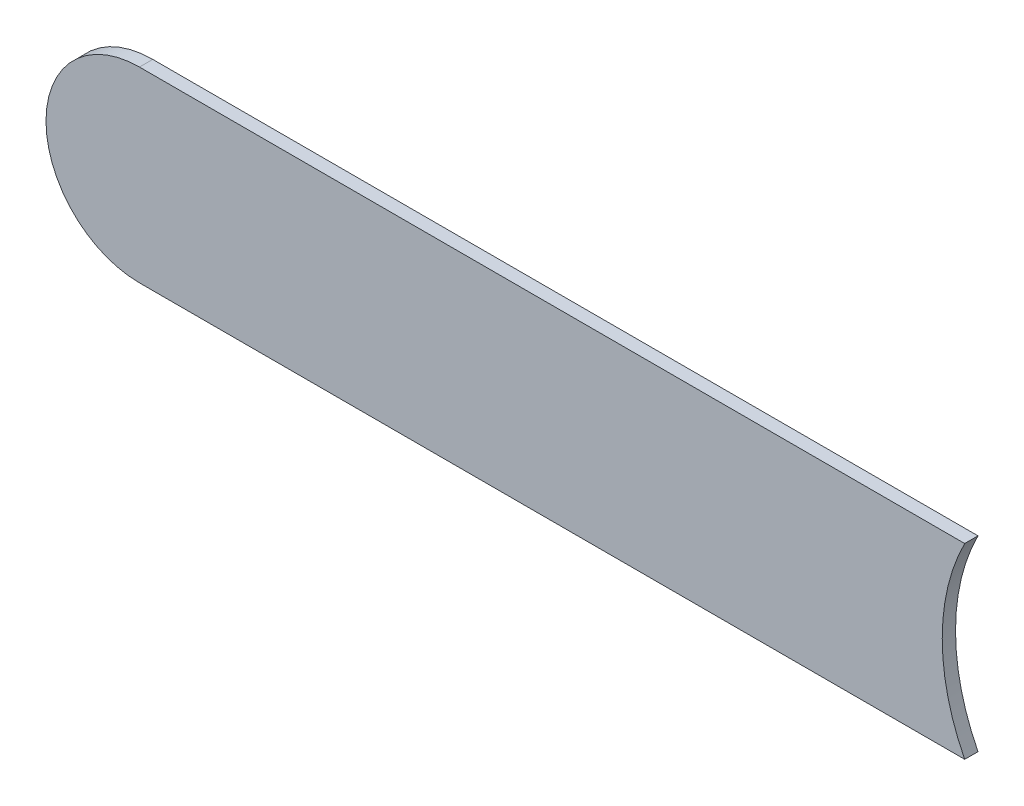
ISO-10303-21;
HEADER;
FILE_DESCRIPTION(('STEP AP214'),'2;1');
FILE_NAME('part.step','',(''),(''),'','','');
FILE_SCHEMA(('AUTOMOTIVE_DESIGN { 1 0 10303 214 1 1 1 1 }'));
ENDSEC;
DATA;
#1=APPLICATION_CONTEXT('core data for automotive mechanical design processes');
#2=APPLICATION_PROTOCOL_DEFINITION('international standard','automotive_design',2000,#1);
#3=PRODUCT_CONTEXT('',#1,'mechanical');
#4=PRODUCT('Part','Part','',(#3));
#5=PRODUCT_RELATED_PRODUCT_CATEGORY('part','',(#4));
#6=PRODUCT_DEFINITION_FORMATION('','',#4);
#7=PRODUCT_DEFINITION_CONTEXT('part definition',#1,'design');
#8=PRODUCT_DEFINITION('design','',#6,#7);
#9=PRODUCT_DEFINITION_SHAPE('','',#8);
#10=(LENGTH_UNIT() NAMED_UNIT(*) SI_UNIT(.MILLI.,.METRE.));
#11=(NAMED_UNIT(*) PLANE_ANGLE_UNIT() SI_UNIT($,.RADIAN.));
#12=(NAMED_UNIT(*) SI_UNIT($,.STERADIAN.) SOLID_ANGLE_UNIT());
#13=UNCERTAINTY_MEASURE_WITH_UNIT(LENGTH_MEASURE(1.E-05),#10,'distance_accuracy_value','');
#14=(GEOMETRIC_REPRESENTATION_CONTEXT(3) GLOBAL_UNCERTAINTY_ASSIGNED_CONTEXT((#13)) GLOBAL_UNIT_ASSIGNED_CONTEXT((#10,
#11,#12)) REPRESENTATION_CONTEXT('',''));
#15=CARTESIAN_POINT('',(0.,0.,0.));
#16=DIRECTION('',(0.,0.,1.));
#17=DIRECTION('',(1.,0.,0.));
#18=AXIS2_PLACEMENT_3D('',#15,#16,#17);
#19=CARTESIAN_POINT('',(94.00673604,52.6432653,0.));
#20=DIRECTION('',(0.,1.,0.));
#21=DIRECTION('',(1.,0.,0.));
#22=AXIS2_PLACEMENT_3D('',#19,#20,#21);
#23=PLANE('',#22);
#24=DIRECTION('',(1.,0.,0.));
#25=VECTOR('',#24,1.);
#26=CARTESIAN_POINT('',(94.00673604,52.6432653,0.03556));
#27=LINE('',#26,#25);
#28=CARTESIAN_POINT('',(94.00673604,52.6432653,0.03556));
#29=VERTEX_POINT('',#28);
#30=CARTESIAN_POINT('',(96.2142530312393,52.6432653,0.03556));
#31=VERTEX_POINT('',#30);
#32=EDGE_CURVE('E11',#29,#31,#27,.T.);
#33=ORIENTED_EDGE('',*,*,#32,.F.);
#34=DIRECTION('',(0.,0.,1.));
#35=VECTOR('',#34,1.);
#36=CARTESIAN_POINT('',(94.00673604,52.6432653,0.));
#37=LINE('',#36,#35);
#38=CARTESIAN_POINT('',(94.00673604,52.6432653,0.));
#39=VERTEX_POINT('',#38);
#40=EDGE_CURVE('E24',#39,#29,#37,.T.);
#41=ORIENTED_EDGE('',*,*,#40,.F.);
#42=DIRECTION('',(1.,0.,0.));
#43=VECTOR('',#42,1.);
#44=CARTESIAN_POINT('',(94.00673604,52.6432653,0.));
#45=LINE('',#44,#43);
#46=CARTESIAN_POINT('',(96.2142530312393,52.6432653,0.));
#47=VERTEX_POINT('',#46);
#48=EDGE_CURVE('E75',#39,#47,#45,.T.);
#49=ORIENTED_EDGE('',*,*,#48,.T.);
#50=DIRECTION('',(0.,0.,1.));
#51=VECTOR('',#50,1.);
#52=CARTESIAN_POINT('',(96.2142530312393,52.6432653,0.));
#53=LINE('',#52,#51);
#54=EDGE_CURVE('E37',#47,#31,#53,.T.);
#55=ORIENTED_EDGE('',*,*,#54,.T.);
#56=EDGE_LOOP('',(#33,#41,#49,#55));
#57=FACE_BOUND('',#56,.T.);
#58=ADVANCED_FACE('F17',(#57),#23,.F.);
#59=CARTESIAN_POINT('',(96.70415,52.8932648,0.));
#60=DIRECTION('',(0.,0.,-1.));
#61=DIRECTION('',(1.,0.,0.));
#62=AXIS2_PLACEMENT_3D('',#59,#60,#61);
#63=CYLINDRICAL_SURFACE('',#62,0.5499989);
#64=DIRECTION('',(0.,0.,1.));
#65=VECTOR('',#64,1.);
#66=CARTESIAN_POINT('',(96.2142530312393,53.1432643,0.));
#67=LINE('',#66,#65);
#68=CARTESIAN_POINT('',(96.2142530312393,53.1432643,0.));
#69=VERTEX_POINT('',#68);
#70=CARTESIAN_POINT('',(96.2142530312393,53.1432643,0.03556));
#71=VERTEX_POINT('',#70);
#72=EDGE_CURVE('E67',#69,#71,#67,.T.);
#73=ORIENTED_EDGE('',*,*,#72,.T.);
#74=CARTESIAN_POINT('',(96.70415,52.8932648,0.03556));
#75=DIRECTION('',(0.,0.,1.));
#76=DIRECTION('',(1.,0.,0.));
#77=AXIS2_PLACEMENT_3D('',#74,#75,#76);
#78=CIRCLE('',#77,0.5499989);
#79=EDGE_CURVE('E82',#71,#31,#78,.T.);
#80=ORIENTED_EDGE('',*,*,#79,.T.);
#81=ORIENTED_EDGE('',*,*,#54,.F.);
#82=CARTESIAN_POINT('',(96.70415,52.8932648,0.));
#83=DIRECTION('',(0.,0.,1.));
#84=DIRECTION('',(1.,0.,0.));
#85=AXIS2_PLACEMENT_3D('',#82,#83,#84);
#86=CIRCLE('',#85,0.5499989);
#87=EDGE_CURVE('E80',#69,#47,#86,.T.);
#88=ORIENTED_EDGE('',*,*,#87,.F.);
#89=EDGE_LOOP('',(#73,#80,#81,#88));
#90=FACE_BOUND('',#89,.T.);
#91=ADVANCED_FACE('F88',(#90),#63,.F.);
#92=CARTESIAN_POINT('',(96.2142530312393,53.1432643,0.));
#93=DIRECTION('',(0.,-1.,0.));
#94=DIRECTION('',(-1.,0.,0.));
#95=AXIS2_PLACEMENT_3D('',#92,#93,#94);
#96=PLANE('',#95);
#97=DIRECTION('',(-1.,0.,0.));
#98=VECTOR('',#97,1.);
#99=CARTESIAN_POINT('',(96.70415,53.1432643,0.03556));
#100=LINE('',#99,#98);
#101=CARTESIAN_POINT('',(94.00673604,53.1432643,0.03556));
#102=VERTEX_POINT('',#101);
#103=EDGE_CURVE('E71',#71,#102,#100,.T.);
#104=ORIENTED_EDGE('',*,*,#103,.F.);
#105=ORIENTED_EDGE('',*,*,#72,.F.);
#106=DIRECTION('',(-1.,0.,0.));
#107=VECTOR('',#106,1.);
#108=CARTESIAN_POINT('',(96.70415,53.1432643,0.));
#109=LINE('',#108,#107);
#110=CARTESIAN_POINT('',(94.00673604,53.1432643,0.));
#111=VERTEX_POINT('',#110);
#112=EDGE_CURVE('E63',#69,#111,#109,.T.);
#113=ORIENTED_EDGE('',*,*,#112,.T.);
#114=DIRECTION('',(0.,0.,1.));
#115=VECTOR('',#114,1.);
#116=CARTESIAN_POINT('',(94.00673604,53.1432643,0.));
#117=LINE('',#116,#115);
#118=EDGE_CURVE('E53',#111,#102,#117,.T.);
#119=ORIENTED_EDGE('',*,*,#118,.T.);
#120=EDGE_LOOP('',(#104,#105,#113,#119));
#121=FACE_BOUND('',#120,.T.);
#122=ADVANCED_FACE('F66',(#121),#96,.F.);
#123=CARTESIAN_POINT('',(94.00673604,52.8932648,0.));
#124=DIRECTION('',(0.,0.,-1.));
#125=DIRECTION('',(0.,1.,0.));
#126=AXIS2_PLACEMENT_3D('',#123,#124,#125);
#127=CYLINDRICAL_SURFACE('',#126,0.249999499999999);
#128=CARTESIAN_POINT('',(94.00673604,52.8932648,0.03556));
#129=DIRECTION('',(0.,0.,1.));
#130=DIRECTION('',(0.,1.,0.));
#131=AXIS2_PLACEMENT_3D('',#128,#129,#130);
#132=CIRCLE('',#131,0.249999499999999);
#133=EDGE_CURVE('E59',#102,#29,#132,.T.);
#134=ORIENTED_EDGE('',*,*,#133,.F.);
#135=ORIENTED_EDGE('',*,*,#118,.F.);
#136=CARTESIAN_POINT('',(94.00673604,52.8932648,0.));
#137=DIRECTION('',(0.,0.,1.));
#138=DIRECTION('',(0.,1.,0.));
#139=AXIS2_PLACEMENT_3D('',#136,#137,#138);
#140=CIRCLE('',#139,0.249999499999999);
#141=EDGE_CURVE('E57',#111,#39,#140,.T.);
#142=ORIENTED_EDGE('',*,*,#141,.T.);
#143=ORIENTED_EDGE('',*,*,#40,.T.);
#144=EDGE_LOOP('',(#134,#135,#142,#143));
#145=FACE_BOUND('',#144,.T.);
#146=ADVANCED_FACE('F55',(#145),#127,.T.);
#147=CARTESIAN_POINT('',(94.00673604,52.6432653,0.));
#148=DIRECTION('',(0.,0.,-1.));
#149=DIRECTION('',(-1.,0.,0.));
#150=AXIS2_PLACEMENT_3D('',#147,#148,#149);
#151=PLANE('',#150);
#152=ORIENTED_EDGE('',*,*,#48,.F.);
#153=ORIENTED_EDGE('',*,*,#141,.F.);
#154=ORIENTED_EDGE('',*,*,#112,.F.);
#155=ORIENTED_EDGE('',*,*,#87,.T.);
#156=EDGE_LOOP('',(#152,#153,#154,#155));
#157=FACE_BOUND('',#156,.T.);
#158=ADVANCED_FACE('F74',(#157),#151,.T.);
#159=CARTESIAN_POINT('',(94.00673604,52.6432653,0.03556));
#160=DIRECTION('',(0.,0.,-1.));
#161=DIRECTION('',(-1.,0.,0.));
#162=AXIS2_PLACEMENT_3D('',#159,#160,#161);
#163=PLANE('',#162);
#164=ORIENTED_EDGE('',*,*,#133,.T.);
#165=ORIENTED_EDGE('',*,*,#32,.T.);
#166=ORIENTED_EDGE('',*,*,#79,.F.);
#167=ORIENTED_EDGE('',*,*,#103,.T.);
#168=EDGE_LOOP('',(#164,#165,#166,#167));
#169=FACE_BOUND('',#168,.T.);
#170=ADVANCED_FACE('F91',(#169),#163,.F.);
#171=CLOSED_SHELL('',(#58,#91,#122,#146,#158,#170));
#172=MANIFOLD_SOLID_BREP('B1',#171);
#173=ADVANCED_BREP_SHAPE_REPRESENTATION('',(#18,#172),#14);
#174=SHAPE_DEFINITION_REPRESENTATION(#9,#173);
ENDSEC;
END-ISO-10303-21;
